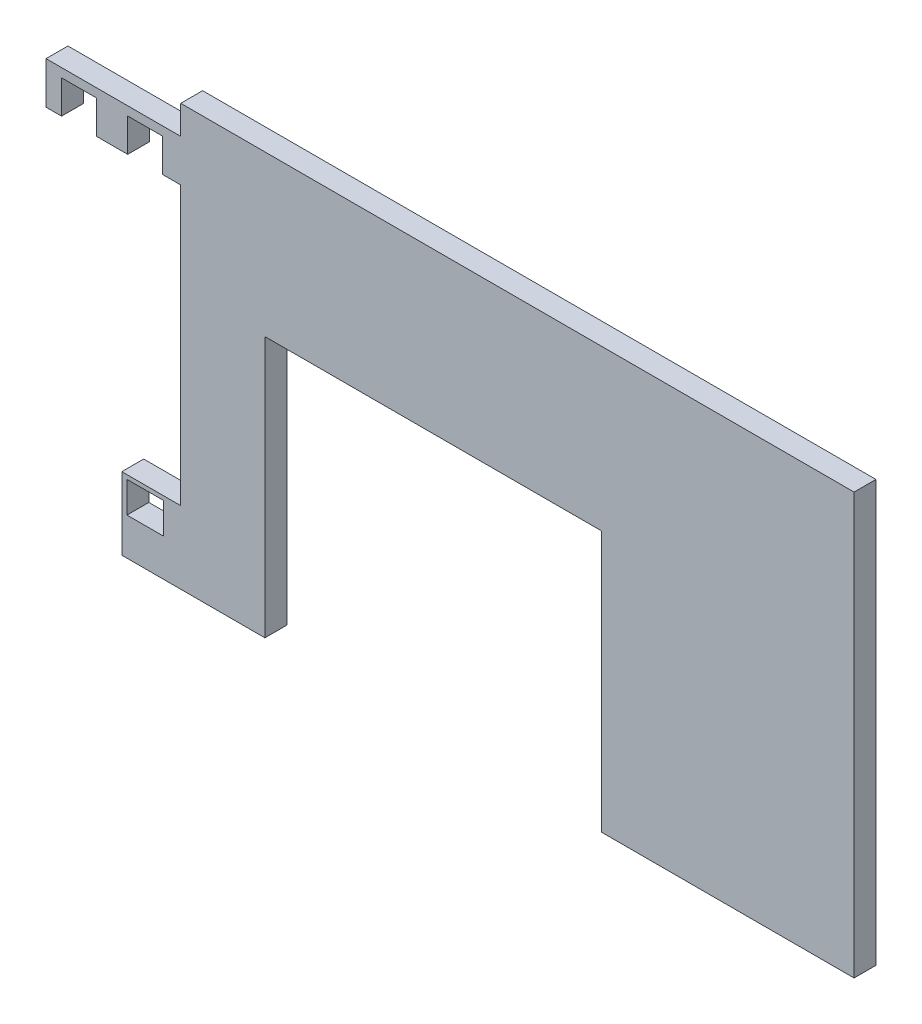
ISO-10303-21;
HEADER;
FILE_DESCRIPTION(('STEP AP214'),'2;1');
FILE_NAME('part.step','',(''),(''),'','','');
FILE_SCHEMA(('AUTOMOTIVE_DESIGN { 1 0 10303 214 1 1 1 1 }'));
ENDSEC;
DATA;
#1=APPLICATION_CONTEXT('core data for automotive mechanical design processes');
#2=APPLICATION_PROTOCOL_DEFINITION('international standard','automotive_design',2000,#1);
#3=PRODUCT_CONTEXT('',#1,'mechanical');
#4=PRODUCT('Part','Part','',(#3));
#5=PRODUCT_RELATED_PRODUCT_CATEGORY('part','',(#4));
#6=PRODUCT_DEFINITION_FORMATION('','',#4);
#7=PRODUCT_DEFINITION_CONTEXT('part definition',#1,'design');
#8=PRODUCT_DEFINITION('design','',#6,#7);
#9=PRODUCT_DEFINITION_SHAPE('','',#8);
#10=(LENGTH_UNIT() NAMED_UNIT(*) SI_UNIT(.MILLI.,.METRE.));
#11=(NAMED_UNIT(*) PLANE_ANGLE_UNIT() SI_UNIT($,.RADIAN.));
#12=(NAMED_UNIT(*) SI_UNIT($,.STERADIAN.) SOLID_ANGLE_UNIT());
#13=UNCERTAINTY_MEASURE_WITH_UNIT(LENGTH_MEASURE(1.E-05),#10,'distance_accuracy_value','');
#14=(GEOMETRIC_REPRESENTATION_CONTEXT(3) GLOBAL_UNCERTAINTY_ASSIGNED_CONTEXT((#13)) GLOBAL_UNIT_ASSIGNED_CONTEXT((#10,
#11,#12)) REPRESENTATION_CONTEXT('',''));
#15=CARTESIAN_POINT('',(0.,0.,0.));
#16=DIRECTION('',(0.,0.,1.));
#17=DIRECTION('',(1.,0.,0.));
#18=AXIS2_PLACEMENT_3D('',#15,#16,#17);
#19=CARTESIAN_POINT('',(-50.8,21.076628061647,-21.2890793600851));
#20=DIRECTION('',(0.,-1.,0.));
#21=DIRECTION('',(0.,0.,-1.));
#22=AXIS2_PLACEMENT_3D('',#19,#20,#21);
#23=PLANE('',#22);
#24=DIRECTION('',(0.,0.,1.));
#25=VECTOR('',#24,1.);
#26=CARTESIAN_POINT('',(-68.7837095780898,21.076628061647,-0.00100000000000013));
#27=LINE('',#26,#25);
#28=CARTESIAN_POINT('',(-68.7837095780898,21.076628061647,0.));
#29=VERTEX_POINT('',#28);
#30=CARTESIAN_POINT('',(-68.7837095780898,21.076628061647,3.302));
#31=VERTEX_POINT('',#30);
#32=EDGE_CURVE('E209',#29,#31,#27,.T.);
#33=ORIENTED_EDGE('',*,*,#32,.T.);
#34=DIRECTION('',(1.,0.,0.));
#35=VECTOR('',#34,1.);
#36=CARTESIAN_POINT('',(-50.8,21.076628061647,3.302));
#37=LINE('',#36,#35);
#38=CARTESIAN_POINT('',(-71.12,21.076628061647,3.302));
#39=VERTEX_POINT('',#38);
#40=EDGE_CURVE('E335',#39,#31,#37,.T.);
#41=ORIENTED_EDGE('',*,*,#40,.F.);
#42=DIRECTION('',(0.,0.,1.));
#43=VECTOR('',#42,1.);
#44=CARTESIAN_POINT('',(-71.12,21.076628061647,-21.2890793600851));
#45=LINE('',#44,#43);
#46=CARTESIAN_POINT('',(-71.12,21.076628061647,0.));
#47=VERTEX_POINT('',#46);
#48=EDGE_CURVE('E231',#47,#39,#45,.T.);
#49=ORIENTED_EDGE('',*,*,#48,.F.);
#50=DIRECTION('',(-1.,0.,0.));
#51=VECTOR('',#50,1.);
#52=CARTESIAN_POINT('',(-50.8,21.076628061647,0.));
#53=LINE('',#52,#51);
#54=EDGE_CURVE('E226',#29,#47,#53,.T.);
#55=ORIENTED_EDGE('',*,*,#54,.F.);
#56=EDGE_LOOP('',(#33,#41,#49,#55));
#57=FACE_BOUND('',#56,.T.);
#58=ADVANCED_FACE('F37',(#57),#23,.T.);
#59=DIRECTION('',(0.,0.,-1.));
#60=VECTOR('',#59,1.);
#61=CARTESIAN_POINT('',(-53.5162904219102,21.076628061647,-0.00100000000000013));
#62=LINE('',#61,#60);
#63=CARTESIAN_POINT('',(-53.5162904219102,21.076628061647,3.302));
#64=VERTEX_POINT('',#63);
#65=CARTESIAN_POINT('',(-53.5162904219102,21.076628061647,0.));
#66=VERTEX_POINT('',#65);
#67=EDGE_CURVE('E363',#64,#66,#62,.T.);
#68=ORIENTED_EDGE('',*,*,#67,.T.);
#69=CARTESIAN_POINT('',(-50.8,21.076628061647,0.));
#70=VERTEX_POINT('',#69);
#71=EDGE_CURVE('E235',#70,#66,#53,.T.);
#72=ORIENTED_EDGE('',*,*,#71,.F.);
#73=DIRECTION('',(0.,0.,1.));
#74=VECTOR('',#73,1.);
#75=CARTESIAN_POINT('',(-50.8,21.076628061647,-21.2890793600851));
#76=LINE('',#75,#74);
#77=CARTESIAN_POINT('',(-50.8,21.076628061647,3.302));
#78=VERTEX_POINT('',#77);
#79=EDGE_CURVE('E237',#70,#78,#76,.T.);
#80=ORIENTED_EDGE('',*,*,#79,.T.);
#81=EDGE_CURVE('E329',#64,#78,#37,.T.);
#82=ORIENTED_EDGE('',*,*,#81,.F.);
#83=EDGE_LOOP('',(#68,#72,#80,#82));
#84=FACE_BOUND('',#83,.T.);
#85=ADVANCED_FACE('F470',(#84),#23,.T.);
#86=CARTESIAN_POINT('',(-50.8,-31.75,3.302));
#87=DIRECTION('',(1.,0.,0.));
#88=DIRECTION('',(0.,0.,-1.));
#89=AXIS2_PLACEMENT_3D('',#86,#87,#88);
#90=PLANE('',#89);
#91=DIRECTION('',(0.,-1.,0.));
#92=VECTOR('',#91,1.);
#93=CARTESIAN_POINT('',(-50.8,-31.75,0.));
#94=LINE('',#93,#92);
#95=CARTESIAN_POINT('',(-50.8,-20.828,0.));
#96=VERTEX_POINT('',#95);
#97=EDGE_CURVE('E277',#70,#96,#94,.T.);
#98=ORIENTED_EDGE('',*,*,#97,.T.);
#99=DIRECTION('',(0.,0.,1.));
#100=VECTOR('',#99,1.);
#101=CARTESIAN_POINT('',(-50.8,-20.828,-21.2890793600851));
#102=LINE('',#101,#100);
#103=CARTESIAN_POINT('',(-50.8,-20.828,3.302));
#104=VERTEX_POINT('',#103);
#105=EDGE_CURVE('E419',#96,#104,#102,.T.);
#106=ORIENTED_EDGE('',*,*,#105,.T.);
#107=DIRECTION('',(0.,-1.,0.));
#108=VECTOR('',#107,1.);
#109=CARTESIAN_POINT('',(-50.8,-31.75,3.302));
#110=LINE('',#109,#108);
#111=EDGE_CURVE('E282',#78,#104,#110,.T.);
#112=ORIENTED_EDGE('',*,*,#111,.F.);
#113=ORIENTED_EDGE('',*,*,#79,.F.);
#114=EDGE_LOOP('',(#98,#106,#112,#113));
#115=FACE_BOUND('',#114,.T.);
#116=ADVANCED_FACE('F428',(#115),#90,.F.);
#117=CARTESIAN_POINT('',(50.8,-31.75,3.302));
#118=DIRECTION('',(0.,1.,0.));
#119=DIRECTION('',(0.,0.,1.));
#120=AXIS2_PLACEMENT_3D('',#117,#118,#119);
#121=PLANE('',#120);
#122=DIRECTION('',(1.,0.,0.));
#123=VECTOR('',#122,1.);
#124=CARTESIAN_POINT('',(50.8,-31.75,0.));
#125=LINE('',#124,#123);
#126=CARTESIAN_POINT('',(-59.69,-31.75,0.));
#127=VERTEX_POINT('',#126);
#128=CARTESIAN_POINT('',(-38.1,-31.75,0.));
#129=VERTEX_POINT('',#128);
#130=EDGE_CURVE('E294',#127,#129,#125,.T.);
#131=ORIENTED_EDGE('',*,*,#130,.T.);
#132=DIRECTION('',(0.,0.,-1.));
#133=VECTOR('',#132,1.);
#134=CARTESIAN_POINT('',(-38.1,-31.75,-0.00100000000000013));
#135=LINE('',#134,#133);
#136=CARTESIAN_POINT('',(-38.1,-31.75,3.302));
#137=VERTEX_POINT('',#136);
#138=EDGE_CURVE('E251',#137,#129,#135,.T.);
#139=ORIENTED_EDGE('',*,*,#138,.F.);
#140=DIRECTION('',(1.,0.,0.));
#141=VECTOR('',#140,1.);
#142=CARTESIAN_POINT('',(50.8,-31.75,3.302));
#143=LINE('',#142,#141);
#144=CARTESIAN_POINT('',(-59.69,-31.75,3.302));
#145=VERTEX_POINT('',#144);
#146=EDGE_CURVE('E283',#145,#137,#143,.T.);
#147=ORIENTED_EDGE('',*,*,#146,.F.);
#148=DIRECTION('',(0.,0.,1.));
#149=VECTOR('',#148,1.);
#150=CARTESIAN_POINT('',(-59.69,-31.75,-21.2890793600851));
#151=LINE('',#150,#149);
#152=EDGE_CURVE('E413',#127,#145,#151,.T.);
#153=ORIENTED_EDGE('',*,*,#152,.F.);
#154=EDGE_LOOP('',(#131,#139,#147,#153));
#155=FACE_BOUND('',#154,.T.);
#156=ADVANCED_FACE('F445',(#155),#121,.F.);
#157=CARTESIAN_POINT('',(-50.8,31.75,0.));
#158=VERTEX_POINT('',#157);
#159=CARTESIAN_POINT('',(-50.8,27.426628061647,0.));
#160=VERTEX_POINT('',#159);
#161=EDGE_CURVE('E291',#158,#160,#94,.T.);
#162=ORIENTED_EDGE('',*,*,#161,.T.);
#163=DIRECTION('',(0.,0.,1.));
#164=VECTOR('',#163,1.);
#165=CARTESIAN_POINT('',(-50.8,27.426628061647,-21.2890793600851));
#166=LINE('',#165,#164);
#167=CARTESIAN_POINT('',(-50.8,27.426628061647,3.302));
#168=VERTEX_POINT('',#167);
#169=EDGE_CURVE('E254',#160,#168,#166,.T.);
#170=ORIENTED_EDGE('',*,*,#169,.T.);
#171=CARTESIAN_POINT('',(-50.8,31.75,3.302));
#172=VERTEX_POINT('',#171);
#173=EDGE_CURVE('E278',#172,#168,#110,.T.);
#174=ORIENTED_EDGE('',*,*,#173,.F.);
#175=DIRECTION('',(0.,0.,-1.));
#176=VECTOR('',#175,1.);
#177=CARTESIAN_POINT('',(-50.8,31.75,3.302));
#178=LINE('',#177,#176);
#179=EDGE_CURVE('E290',#172,#158,#178,.T.);
#180=ORIENTED_EDGE('',*,*,#179,.T.);
#181=EDGE_LOOP('',(#162,#170,#174,#180));
#182=FACE_BOUND('',#181,.T.);
#183=ADVANCED_FACE('F39',(#182),#90,.F.);
#184=CARTESIAN_POINT('',(12.7,-31.75,3.302));
#185=VERTEX_POINT('',#184);
#186=CARTESIAN_POINT('',(50.8,-31.75,3.302));
#187=VERTEX_POINT('',#186);
#188=EDGE_CURVE('E281',#185,#187,#143,.T.);
#189=ORIENTED_EDGE('',*,*,#188,.F.);
#190=DIRECTION('',(0.,0.,1.));
#191=VECTOR('',#190,1.);
#192=CARTESIAN_POINT('',(12.7,-31.75,-0.00100000000000013));
#193=LINE('',#192,#191);
#194=CARTESIAN_POINT('',(12.7,-31.75,0.));
#195=VERTEX_POINT('',#194);
#196=EDGE_CURVE('E246',#195,#185,#193,.T.);
#197=ORIENTED_EDGE('',*,*,#196,.F.);
#198=CARTESIAN_POINT('',(50.8,-31.75,0.));
#199=VERTEX_POINT('',#198);
#200=EDGE_CURVE('E293',#195,#199,#125,.T.);
#201=ORIENTED_EDGE('',*,*,#200,.T.);
#202=DIRECTION('',(0.,0.,-1.));
#203=VECTOR('',#202,1.);
#204=CARTESIAN_POINT('',(50.8,-31.75,3.302));
#205=LINE('',#204,#203);
#206=EDGE_CURVE('E11',#187,#199,#205,.T.);
#207=ORIENTED_EDGE('',*,*,#206,.F.);
#208=EDGE_LOOP('',(#189,#197,#201,#207));
#209=FACE_BOUND('',#208,.T.);
#210=ADVANCED_FACE('F460',(#209),#121,.F.);
#211=CARTESIAN_POINT('',(50.8,-31.75,3.302));
#212=DIRECTION('',(-1.,0.,0.));
#213=DIRECTION('',(0.,0.,1.));
#214=AXIS2_PLACEMENT_3D('',#211,#212,#213);
#215=PLANE('',#214);
#216=DIRECTION('',(0.,1.,0.));
#217=VECTOR('',#216,1.);
#218=CARTESIAN_POINT('',(50.8,-31.75,0.));
#219=LINE('',#218,#217);
#220=CARTESIAN_POINT('',(50.8,31.75,0.));
#221=VERTEX_POINT('',#220);
#222=EDGE_CURVE('E297',#199,#221,#219,.T.);
#223=ORIENTED_EDGE('',*,*,#222,.T.);
#224=DIRECTION('',(0.,0.,-1.));
#225=VECTOR('',#224,1.);
#226=CARTESIAN_POINT('',(50.8,31.75,3.302));
#227=LINE('',#226,#225);
#228=CARTESIAN_POINT('',(50.8,31.75,3.302));
#229=VERTEX_POINT('',#228);
#230=EDGE_CURVE('E45',#229,#221,#227,.T.);
#231=ORIENTED_EDGE('',*,*,#230,.F.);
#232=DIRECTION('',(0.,1.,0.));
#233=VECTOR('',#232,1.);
#234=CARTESIAN_POINT('',(50.8,-31.75,3.302));
#235=LINE('',#234,#233);
#236=EDGE_CURVE('E286',#187,#229,#235,.T.);
#237=ORIENTED_EDGE('',*,*,#236,.F.);
#238=ORIENTED_EDGE('',*,*,#206,.T.);
#239=EDGE_LOOP('',(#223,#231,#237,#238));
#240=FACE_BOUND('',#239,.T.);
#241=ADVANCED_FACE('F461',(#240),#215,.F.);
#242=CARTESIAN_POINT('',(50.8,31.75,3.302));
#243=DIRECTION('',(0.,-1.,0.));
#244=DIRECTION('',(0.,0.,-1.));
#245=AXIS2_PLACEMENT_3D('',#242,#243,#244);
#246=PLANE('',#245);
#247=DIRECTION('',(-1.,0.,0.));
#248=VECTOR('',#247,1.);
#249=CARTESIAN_POINT('',(50.8,31.75,0.));
#250=LINE('',#249,#248);
#251=EDGE_CURVE('E299',#221,#158,#250,.T.);
#252=ORIENTED_EDGE('',*,*,#251,.T.);
#253=ORIENTED_EDGE('',*,*,#179,.F.);
#254=DIRECTION('',(-1.,0.,0.));
#255=VECTOR('',#254,1.);
#256=CARTESIAN_POINT('',(50.8,31.75,3.302));
#257=LINE('',#256,#255);
#258=EDGE_CURVE('E288',#229,#172,#257,.T.);
#259=ORIENTED_EDGE('',*,*,#258,.F.);
#260=ORIENTED_EDGE('',*,*,#230,.T.);
#261=EDGE_LOOP('',(#252,#253,#259,#260));
#262=FACE_BOUND('',#261,.T.);
#263=ADVANCED_FACE('F307',(#262),#246,.F.);
#264=CARTESIAN_POINT('',(0.,0.,3.302));
#265=DIRECTION('',(0.,0.,1.));
#266=DIRECTION('',(1.,0.,0.));
#267=AXIS2_PLACEMENT_3D('',#264,#265,#266);
#268=PLANE('',#267);
#269=DIRECTION('',(0.,-1.,0.));
#270=VECTOR('',#269,1.);
#271=CARTESIAN_POINT('',(-68.7837095780898,26.0929863981767,3.302));
#272=LINE('',#271,#270);
#273=CARTESIAN_POINT('',(-68.7837095780898,26.0929863981767,3.302));
#274=VERTEX_POINT('',#273);
#275=EDGE_CURVE('E215',#274,#31,#272,.T.);
#276=ORIENTED_EDGE('',*,*,#275,.F.);
#277=DIRECTION('',(-1.,0.,0.));
#278=VECTOR('',#277,1.);
#279=CARTESIAN_POINT('',(-68.7837095780898,26.0929863981767,3.302));
#280=LINE('',#279,#278);
#281=CARTESIAN_POINT('',(-63.4988664599956,26.0929863981767,3.302));
#282=VERTEX_POINT('',#281);
#283=EDGE_CURVE('E345',#282,#274,#280,.T.);
#284=ORIENTED_EDGE('',*,*,#283,.F.);
#285=DIRECTION('',(0.,1.,0.));
#286=VECTOR('',#285,1.);
#287=CARTESIAN_POINT('',(-63.4988664599956,26.0929863981767,3.302));
#288=LINE('',#287,#286);
#289=CARTESIAN_POINT('',(-63.4988664599956,21.076628061647,3.302));
#290=VERTEX_POINT('',#289);
#291=EDGE_CURVE('E346',#290,#282,#288,.T.);
#292=ORIENTED_EDGE('',*,*,#291,.F.);
#293=CARTESIAN_POINT('',(-58.8011335400044,21.076628061647,3.302));
#294=VERTEX_POINT('',#293);
#295=EDGE_CURVE('E337',#290,#294,#37,.T.);
#296=ORIENTED_EDGE('',*,*,#295,.T.);
#297=DIRECTION('',(0.,-1.,0.));
#298=VECTOR('',#297,1.);
#299=CARTESIAN_POINT('',(-58.8011335400044,26.0929863981767,3.302));
#300=LINE('',#299,#298);
#301=CARTESIAN_POINT('',(-58.8011335400044,26.0929863981767,3.302));
#302=VERTEX_POINT('',#301);
#303=EDGE_CURVE('E374',#302,#294,#300,.T.);
#304=ORIENTED_EDGE('',*,*,#303,.F.);
#305=DIRECTION('',(-1.,0.,0.));
#306=VECTOR('',#305,1.);
#307=CARTESIAN_POINT('',(-53.5162904219102,26.0929863981767,3.302));
#308=LINE('',#307,#306);
#309=CARTESIAN_POINT('',(-53.5162904219102,26.0929863981767,3.302));
#310=VERTEX_POINT('',#309);
#311=EDGE_CURVE('E371',#310,#302,#308,.T.);
#312=ORIENTED_EDGE('',*,*,#311,.F.);
#313=DIRECTION('',(0.,1.,0.));
#314=VECTOR('',#313,1.);
#315=CARTESIAN_POINT('',(-53.5162904219102,26.0929863981767,3.302));
#316=LINE('',#315,#314);
#317=EDGE_CURVE('E376',#64,#310,#316,.T.);
#318=ORIENTED_EDGE('',*,*,#317,.F.);
#319=ORIENTED_EDGE('',*,*,#81,.T.);
#320=ORIENTED_EDGE('',*,*,#111,.T.);
#321=DIRECTION('',(-1.,0.,0.));
#322=VECTOR('',#321,1.);
#323=CARTESIAN_POINT('',(-50.8,-20.828,3.302));
#324=LINE('',#323,#322);
#325=CARTESIAN_POINT('',(-59.69,-20.828,3.302));
#326=VERTEX_POINT('',#325);
#327=EDGE_CURVE('E359',#104,#326,#324,.T.);
#328=ORIENTED_EDGE('',*,*,#327,.T.);
#329=DIRECTION('',(0.,-1.,0.));
#330=VECTOR('',#329,1.);
#331=CARTESIAN_POINT('',(-59.69,-31.75,3.302));
#332=LINE('',#331,#330);
#333=EDGE_CURVE('E416',#326,#145,#332,.T.);
#334=ORIENTED_EDGE('',*,*,#333,.T.);
#335=ORIENTED_EDGE('',*,*,#146,.T.);
#336=DIRECTION('',(0.,-1.,0.));
#337=VECTOR('',#336,1.);
#338=CARTESIAN_POINT('',(-38.1,-38.1,3.302));
#339=LINE('',#338,#337);
#340=CARTESIAN_POINT('',(-38.1,7.62000000000001,3.302));
#341=VERTEX_POINT('',#340);
#342=EDGE_CURVE('E263',#341,#137,#339,.T.);
#343=ORIENTED_EDGE('',*,*,#342,.F.);
#344=DIRECTION('',(-1.,0.,0.));
#345=VECTOR('',#344,1.);
#346=CARTESIAN_POINT('',(-38.1,7.62000000000001,3.302));
#347=LINE('',#346,#345);
#348=CARTESIAN_POINT('',(12.7,7.62000000000001,3.302));
#349=VERTEX_POINT('',#348);
#350=EDGE_CURVE('E268',#349,#341,#347,.T.);
#351=ORIENTED_EDGE('',*,*,#350,.F.);
#352=DIRECTION('',(0.,1.,0.));
#353=VECTOR('',#352,1.);
#354=CARTESIAN_POINT('',(12.7,-38.1,3.302));
#355=LINE('',#354,#353);
#356=EDGE_CURVE('E265',#185,#349,#355,.T.);
#357=ORIENTED_EDGE('',*,*,#356,.F.);
#358=ORIENTED_EDGE('',*,*,#188,.T.);
#359=ORIENTED_EDGE('',*,*,#236,.T.);
#360=ORIENTED_EDGE('',*,*,#258,.T.);
#361=ORIENTED_EDGE('',*,*,#173,.T.);
#362=DIRECTION('',(-1.,0.,0.));
#363=VECTOR('',#362,1.);
#364=CARTESIAN_POINT('',(-50.8,27.426628061647,3.302));
#365=LINE('',#364,#363);
#366=CARTESIAN_POINT('',(-71.12,27.426628061647,3.302));
#367=VERTEX_POINT('',#366);
#368=EDGE_CURVE('E321',#168,#367,#365,.T.);
#369=ORIENTED_EDGE('',*,*,#368,.T.);
#370=DIRECTION('',(0.,-1.,0.));
#371=VECTOR('',#370,1.);
#372=CARTESIAN_POINT('',(-71.12,21.076628061647,3.302));
#373=LINE('',#372,#371);
#374=EDGE_CURVE('E327',#367,#39,#373,.T.);
#375=ORIENTED_EDGE('',*,*,#374,.T.);
#376=ORIENTED_EDGE('',*,*,#40,.T.);
#377=EDGE_LOOP('',(#276,#284,#292,#296,#304,#312,#318,#319,#320,#328,#334,#335,#343,#351,#357,
#358,#359,#360,#361,#369,#375,#376));
#378=FACE_BOUND('',#377,.T.);
#379=DIRECTION('',(0.,-1.,0.));
#380=VECTOR('',#379,1.);
#381=CARTESIAN_POINT('',(-58.9105914384986,-21.444804226857,3.302));
#382=LINE('',#381,#380);
#383=CARTESIAN_POINT('',(-58.9105914384986,-21.444804226857,3.302));
#384=VERTEX_POINT('',#383);
#385=CARTESIAN_POINT('',(-58.9105914384986,-26.1131993870927,3.302));
#386=VERTEX_POINT('',#385);
#387=EDGE_CURVE('E52',#384,#386,#382,.T.);
#388=ORIENTED_EDGE('',*,*,#387,.F.);
#389=DIRECTION('',(-1.,0.,0.));
#390=VECTOR('',#389,1.);
#391=CARTESIAN_POINT('',(-58.9105914384986,-21.444804226857,3.302));
#392=LINE('',#391,#390);
#393=CARTESIAN_POINT('',(-53.3876390819089,-21.444804226857,3.302));
#394=VERTEX_POINT('',#393);
#395=EDGE_CURVE('E399',#394,#384,#392,.T.);
#396=ORIENTED_EDGE('',*,*,#395,.F.);
#397=DIRECTION('',(0.,1.,0.));
#398=VECTOR('',#397,1.);
#399=CARTESIAN_POINT('',(-53.3876390819089,-21.444804226857,3.302));
#400=LINE('',#399,#398);
#401=CARTESIAN_POINT('',(-53.3876390819089,-26.1131993870927,3.302));
#402=VERTEX_POINT('',#401);
#403=EDGE_CURVE('E396',#402,#394,#400,.T.);
#404=ORIENTED_EDGE('',*,*,#403,.F.);
#405=DIRECTION('',(1.,0.,0.));
#406=VECTOR('',#405,1.);
#407=CARTESIAN_POINT('',(-58.9105914384986,-26.1131993870927,3.302));
#408=LINE('',#407,#406);
#409=EDGE_CURVE('E393',#386,#402,#408,.T.);
#410=ORIENTED_EDGE('',*,*,#409,.F.);
#411=EDGE_LOOP('',(#388,#396,#404,#410));
#412=FACE_BOUND('',#411,.T.);
#413=ADVANCED_FACE('F318',(#378,#412),#268,.T.);
#414=CARTESIAN_POINT('',(0.,0.,0.));
#415=DIRECTION('',(0.,0.,1.));
#416=DIRECTION('',(1.,0.,0.));
#417=AXIS2_PLACEMENT_3D('',#414,#415,#416);
#418=PLANE('',#417);
#419=DIRECTION('',(1.,0.,0.));
#420=VECTOR('',#419,1.);
#421=CARTESIAN_POINT('',(-58.9105914384986,-21.444804226857,0.));
#422=LINE('',#421,#420);
#423=CARTESIAN_POINT('',(-58.9105914384986,-21.444804226857,0.));
#424=VERTEX_POINT('',#423);
#425=CARTESIAN_POINT('',(-53.3876390819089,-21.444804226857,0.));
#426=VERTEX_POINT('',#425);
#427=EDGE_CURVE('E386',#424,#426,#422,.T.);
#428=ORIENTED_EDGE('',*,*,#427,.F.);
#429=DIRECTION('',(0.,1.,0.));
#430=VECTOR('',#429,1.);
#431=CARTESIAN_POINT('',(-58.9105914384986,-21.444804226857,0.));
#432=LINE('',#431,#430);
#433=CARTESIAN_POINT('',(-58.9105914384986,-26.1131993870927,0.));
#434=VERTEX_POINT('',#433);
#435=EDGE_CURVE('E389',#434,#424,#432,.T.);
#436=ORIENTED_EDGE('',*,*,#435,.F.);
#437=DIRECTION('',(-1.,0.,0.));
#438=VECTOR('',#437,1.);
#439=CARTESIAN_POINT('',(-58.9105914384986,-26.1131993870927,0.));
#440=LINE('',#439,#438);
#441=CARTESIAN_POINT('',(-53.3876390819089,-26.1131993870927,0.));
#442=VERTEX_POINT('',#441);
#443=EDGE_CURVE('E364',#442,#434,#440,.T.);
#444=ORIENTED_EDGE('',*,*,#443,.F.);
#445=DIRECTION('',(0.,-1.,0.));
#446=VECTOR('',#445,1.);
#447=CARTESIAN_POINT('',(-53.3876390819089,-21.444804226857,0.));
#448=LINE('',#447,#446);
#449=EDGE_CURVE('E60',#426,#442,#448,.T.);
#450=ORIENTED_EDGE('',*,*,#449,.F.);
#451=EDGE_LOOP('',(#428,#436,#444,#450));
#452=FACE_BOUND('',#451,.T.);
#453=DIRECTION('',(1.,0.,0.));
#454=VECTOR('',#453,1.);
#455=CARTESIAN_POINT('',(-68.7837095780898,26.0929863981767,0.));
#456=LINE('',#455,#454);
#457=CARTESIAN_POINT('',(-68.7837095780898,26.0929863981767,0.));
#458=VERTEX_POINT('',#457);
#459=CARTESIAN_POINT('',(-63.4988664599956,26.0929863981767,0.));
#460=VERTEX_POINT('',#459);
#461=EDGE_CURVE('E220',#458,#460,#456,.T.);
#462=ORIENTED_EDGE('',*,*,#461,.F.);
#463=DIRECTION('',(0.,1.,0.));
#464=VECTOR('',#463,1.);
#465=CARTESIAN_POINT('',(-68.7837095780898,26.0929863981767,0.));
#466=LINE('',#465,#464);
#467=EDGE_CURVE('E212',#29,#458,#466,.T.);
#468=ORIENTED_EDGE('',*,*,#467,.F.);
#469=ORIENTED_EDGE('',*,*,#54,.T.);
#470=DIRECTION('',(0.,1.,0.));
#471=VECTOR('',#470,1.);
#472=CARTESIAN_POINT('',(-71.12,21.076628061647,0.));
#473=LINE('',#472,#471);
#474=CARTESIAN_POINT('',(-71.12,27.426628061647,0.));
#475=VERTEX_POINT('',#474);
#476=EDGE_CURVE('E233',#47,#475,#473,.T.);
#477=ORIENTED_EDGE('',*,*,#476,.T.);
#478=DIRECTION('',(1.,0.,0.));
#479=VECTOR('',#478,1.);
#480=CARTESIAN_POINT('',(-50.8,27.426628061647,0.));
#481=LINE('',#480,#479);
#482=EDGE_CURVE('E241',#475,#160,#481,.T.);
#483=ORIENTED_EDGE('',*,*,#482,.T.);
#484=ORIENTED_EDGE('',*,*,#161,.F.);
#485=ORIENTED_EDGE('',*,*,#251,.F.);
#486=ORIENTED_EDGE('',*,*,#222,.F.);
#487=ORIENTED_EDGE('',*,*,#200,.F.);
#488=DIRECTION('',(0.,-1.,0.));
#489=VECTOR('',#488,1.);
#490=CARTESIAN_POINT('',(12.7,-38.1,0.));
#491=LINE('',#490,#489);
#492=CARTESIAN_POINT('',(12.7,7.62000000000001,0.));
#493=VERTEX_POINT('',#492);
#494=EDGE_CURVE('E274',#493,#195,#491,.T.);
#495=ORIENTED_EDGE('',*,*,#494,.F.);
#496=DIRECTION('',(1.,0.,0.));
#497=VECTOR('',#496,1.);
#498=CARTESIAN_POINT('',(-38.1,7.62000000000001,0.));
#499=LINE('',#498,#497);
#500=CARTESIAN_POINT('',(-38.1,7.62000000000001,0.));
#501=VERTEX_POINT('',#500);
#502=EDGE_CURVE('E258',#501,#493,#499,.T.);
#503=ORIENTED_EDGE('',*,*,#502,.F.);
#504=DIRECTION('',(0.,1.,0.));
#505=VECTOR('',#504,1.);
#506=CARTESIAN_POINT('',(-38.1,-38.1,0.));
#507=LINE('',#506,#505);
#508=EDGE_CURVE('E261',#129,#501,#507,.T.);
#509=ORIENTED_EDGE('',*,*,#508,.F.);
#510=ORIENTED_EDGE('',*,*,#130,.F.);
#511=DIRECTION('',(0.,1.,0.));
#512=VECTOR('',#511,1.);
#513=CARTESIAN_POINT('',(-59.69,-31.75,0.));
#514=LINE('',#513,#512);
#515=CARTESIAN_POINT('',(-59.69,-20.828,0.));
#516=VERTEX_POINT('',#515);
#517=EDGE_CURVE('E332',#127,#516,#514,.T.);
#518=ORIENTED_EDGE('',*,*,#517,.T.);
#519=DIRECTION('',(1.,0.,0.));
#520=VECTOR('',#519,1.);
#521=CARTESIAN_POINT('',(-50.8,-20.828,0.));
#522=LINE('',#521,#520);
#523=EDGE_CURVE('E328',#516,#96,#522,.T.);
#524=ORIENTED_EDGE('',*,*,#523,.T.);
#525=ORIENTED_EDGE('',*,*,#97,.F.);
#526=ORIENTED_EDGE('',*,*,#71,.T.);
#527=DIRECTION('',(0.,-1.,0.));
#528=VECTOR('',#527,1.);
#529=CARTESIAN_POINT('',(-53.5162904219102,26.0929863981767,0.));
#530=LINE('',#529,#528);
#531=CARTESIAN_POINT('',(-53.5162904219102,26.0929863981767,0.));
#532=VERTEX_POINT('',#531);
#533=EDGE_CURVE('E369',#532,#66,#530,.T.);
#534=ORIENTED_EDGE('',*,*,#533,.F.);
#535=DIRECTION('',(1.,0.,0.));
#536=VECTOR('',#535,1.);
#537=CARTESIAN_POINT('',(-53.5162904219102,26.0929863981767,0.));
#538=LINE('',#537,#536);
#539=CARTESIAN_POINT('',(-58.8011335400044,26.0929863981767,0.));
#540=VERTEX_POINT('',#539);
#541=EDGE_CURVE('E367',#540,#532,#538,.T.);
#542=ORIENTED_EDGE('',*,*,#541,.F.);
#543=DIRECTION('',(0.,1.,0.));
#544=VECTOR('',#543,1.);
#545=CARTESIAN_POINT('',(-58.8011335400044,26.0929863981767,0.));
#546=LINE('',#545,#544);
#547=CARTESIAN_POINT('',(-58.8011335400044,21.076628061647,0.));
#548=VERTEX_POINT('',#547);
#549=EDGE_CURVE('E382',#548,#540,#546,.T.);
#550=ORIENTED_EDGE('',*,*,#549,.F.);
#551=CARTESIAN_POINT('',(-63.4988664599956,21.076628061647,0.));
#552=VERTEX_POINT('',#551);
#553=EDGE_CURVE('E232',#548,#552,#53,.T.);
#554=ORIENTED_EDGE('',*,*,#553,.T.);
#555=DIRECTION('',(0.,-1.,0.));
#556=VECTOR('',#555,1.);
#557=CARTESIAN_POINT('',(-63.4988664599956,26.0929863981767,0.));
#558=LINE('',#557,#556);
#559=EDGE_CURVE('E356',#460,#552,#558,.T.);
#560=ORIENTED_EDGE('',*,*,#559,.F.);
#561=EDGE_LOOP('',(#462,#468,#469,#477,#483,#484,#485,#486,#487,#495,#503,#509,#510,#518,#524,
#525,#526,#534,#542,#550,#554,#560));
#562=FACE_BOUND('',#561,.T.);
#563=ADVANCED_FACE('F225',(#452,#562),#418,.F.);
#564=CARTESIAN_POINT('',(-38.1,-38.1,-0.00100000000000013));
#565=DIRECTION('',(-1.,0.,0.));
#566=DIRECTION('',(0.,0.,1.));
#567=AXIS2_PLACEMENT_3D('',#564,#565,#566);
#568=PLANE('',#567);
#569=ORIENTED_EDGE('',*,*,#138,.T.);
#570=ORIENTED_EDGE('',*,*,#508,.T.);
#571=DIRECTION('',(0.,0.,1.));
#572=VECTOR('',#571,1.);
#573=CARTESIAN_POINT('',(-38.1,7.62000000000001,-0.00100000000000013));
#574=LINE('',#573,#572);
#575=EDGE_CURVE('E272',#501,#341,#574,.T.);
#576=ORIENTED_EDGE('',*,*,#575,.T.);
#577=ORIENTED_EDGE('',*,*,#342,.T.);
#578=EDGE_LOOP('',(#569,#570,#576,#577));
#579=FACE_BOUND('',#578,.T.);
#580=ADVANCED_FACE('F448',(#579),#568,.F.);
#581=CARTESIAN_POINT('',(-38.1,7.62000000000001,-0.00100000000000013));
#582=DIRECTION('',(0.,1.,0.));
#583=DIRECTION('',(0.,0.,1.));
#584=AXIS2_PLACEMENT_3D('',#581,#582,#583);
#585=PLANE('',#584);
#586=ORIENTED_EDGE('',*,*,#502,.T.);
#587=DIRECTION('',(0.,0.,1.));
#588=VECTOR('',#587,1.);
#589=CARTESIAN_POINT('',(12.7,7.62000000000001,-0.00100000000000013));
#590=LINE('',#589,#588);
#591=EDGE_CURVE('E271',#493,#349,#590,.T.);
#592=ORIENTED_EDGE('',*,*,#591,.T.);
#593=ORIENTED_EDGE('',*,*,#350,.T.);
#594=ORIENTED_EDGE('',*,*,#575,.F.);
#595=EDGE_LOOP('',(#586,#592,#593,#594));
#596=FACE_BOUND('',#595,.T.);
#597=ADVANCED_FACE('F453',(#596),#585,.F.);
#598=CARTESIAN_POINT('',(12.7,-38.1,-0.00100000000000013));
#599=DIRECTION('',(1.,0.,0.));
#600=DIRECTION('',(0.,0.,-1.));
#601=AXIS2_PLACEMENT_3D('',#598,#599,#600);
#602=PLANE('',#601);
#603=ORIENTED_EDGE('',*,*,#196,.T.);
#604=ORIENTED_EDGE('',*,*,#356,.T.);
#605=ORIENTED_EDGE('',*,*,#591,.F.);
#606=ORIENTED_EDGE('',*,*,#494,.T.);
#607=EDGE_LOOP('',(#603,#604,#605,#606));
#608=FACE_BOUND('',#607,.T.);
#609=ADVANCED_FACE('F481',(#608),#602,.F.);
#610=DIRECTION('',(0.,0.,-1.));
#611=VECTOR('',#610,1.);
#612=CARTESIAN_POINT('',(-63.4988664599956,21.076628061647,-0.00100000000000013));
#613=LINE('',#612,#611);
#614=EDGE_CURVE('E221',#290,#552,#613,.T.);
#615=ORIENTED_EDGE('',*,*,#614,.T.);
#616=ORIENTED_EDGE('',*,*,#553,.F.);
#617=DIRECTION('',(0.,0.,1.));
#618=VECTOR('',#617,1.);
#619=CARTESIAN_POINT('',(-58.8011335400044,21.076628061647,-0.00100000000000013));
#620=LINE('',#619,#618);
#621=EDGE_CURVE('E360',#548,#294,#620,.T.);
#622=ORIENTED_EDGE('',*,*,#621,.T.);
#623=ORIENTED_EDGE('',*,*,#295,.F.);
#624=EDGE_LOOP('',(#615,#616,#622,#623));
#625=FACE_BOUND('',#624,.T.);
#626=ADVANCED_FACE('F472',(#625),#23,.T.);
#627=CARTESIAN_POINT('',(-71.12,21.076628061647,-21.2890793600851));
#628=DIRECTION('',(-1.,0.,0.));
#629=DIRECTION('',(0.,0.,1.));
#630=AXIS2_PLACEMENT_3D('',#627,#628,#629);
#631=PLANE('',#630);
#632=ORIENTED_EDGE('',*,*,#476,.F.);
#633=ORIENTED_EDGE('',*,*,#48,.T.);
#634=ORIENTED_EDGE('',*,*,#374,.F.);
#635=DIRECTION('',(0.,0.,1.));
#636=VECTOR('',#635,1.);
#637=CARTESIAN_POINT('',(-71.12,27.426628061647,-21.2890793600851));
#638=LINE('',#637,#636);
#639=EDGE_CURVE('E325',#475,#367,#638,.T.);
#640=ORIENTED_EDGE('',*,*,#639,.F.);
#641=EDGE_LOOP('',(#632,#633,#634,#640));
#642=FACE_BOUND('',#641,.T.);
#643=ADVANCED_FACE('F341',(#642),#631,.T.);
#644=CARTESIAN_POINT('',(-50.8,27.426628061647,-21.2890793600851));
#645=DIRECTION('',(0.,1.,0.));
#646=DIRECTION('',(0.,0.,1.));
#647=AXIS2_PLACEMENT_3D('',#644,#645,#646);
#648=PLANE('',#647);
#649=ORIENTED_EDGE('',*,*,#482,.F.);
#650=ORIENTED_EDGE('',*,*,#639,.T.);
#651=ORIENTED_EDGE('',*,*,#368,.F.);
#652=ORIENTED_EDGE('',*,*,#169,.F.);
#653=EDGE_LOOP('',(#649,#650,#651,#652));
#654=FACE_BOUND('',#653,.T.);
#655=ADVANCED_FACE('F323',(#654),#648,.T.);
#656=CARTESIAN_POINT('',(-59.69,-31.75,-21.2890793600851));
#657=DIRECTION('',(-1.,0.,0.));
#658=DIRECTION('',(0.,-1.,0.));
#659=AXIS2_PLACEMENT_3D('',#656,#657,#658);
#660=PLANE('',#659);
#661=ORIENTED_EDGE('',*,*,#517,.F.);
#662=ORIENTED_EDGE('',*,*,#152,.T.);
#663=ORIENTED_EDGE('',*,*,#333,.F.);
#664=DIRECTION('',(0.,0.,1.));
#665=VECTOR('',#664,1.);
#666=CARTESIAN_POINT('',(-59.69,-20.828,-21.2890793600851));
#667=LINE('',#666,#665);
#668=EDGE_CURVE('E422',#516,#326,#667,.T.);
#669=ORIENTED_EDGE('',*,*,#668,.F.);
#670=EDGE_LOOP('',(#661,#662,#663,#669));
#671=FACE_BOUND('',#670,.T.);
#672=ADVANCED_FACE('F439',(#671),#660,.T.);
#673=CARTESIAN_POINT('',(-50.8,-20.828,-21.2890793600851));
#674=DIRECTION('',(0.,1.,0.));
#675=DIRECTION('',(0.,0.,1.));
#676=AXIS2_PLACEMENT_3D('',#673,#674,#675);
#677=PLANE('',#676);
#678=ORIENTED_EDGE('',*,*,#523,.F.);
#679=ORIENTED_EDGE('',*,*,#668,.T.);
#680=ORIENTED_EDGE('',*,*,#327,.F.);
#681=ORIENTED_EDGE('',*,*,#105,.F.);
#682=EDGE_LOOP('',(#678,#679,#680,#681));
#683=FACE_BOUND('',#682,.T.);
#684=ADVANCED_FACE('F434',(#683),#677,.T.);
#685=CARTESIAN_POINT('',(-53.5162904219102,26.0929863981767,-0.00100000000000013));
#686=DIRECTION('',(0.,1.,0.));
#687=DIRECTION('',(0.,0.,1.));
#688=AXIS2_PLACEMENT_3D('',#685,#686,#687);
#689=PLANE('',#688);
#690=ORIENTED_EDGE('',*,*,#541,.T.);
#691=DIRECTION('',(0.,0.,1.));
#692=VECTOR('',#691,1.);
#693=CARTESIAN_POINT('',(-53.5162904219102,26.0929863981767,-0.00100000000000013));
#694=LINE('',#693,#692);
#695=EDGE_CURVE('E380',#532,#310,#694,.T.);
#696=ORIENTED_EDGE('',*,*,#695,.T.);
#697=ORIENTED_EDGE('',*,*,#311,.T.);
#698=DIRECTION('',(0.,0.,1.));
#699=VECTOR('',#698,1.);
#700=CARTESIAN_POINT('',(-58.8011335400044,26.0929863981767,-0.00100000000000013));
#701=LINE('',#700,#699);
#702=EDGE_CURVE('E379',#540,#302,#701,.T.);
#703=ORIENTED_EDGE('',*,*,#702,.F.);
#704=EDGE_LOOP('',(#690,#696,#697,#703));
#705=FACE_BOUND('',#704,.T.);
#706=ADVANCED_FACE('F501',(#705),#689,.F.);
#707=CARTESIAN_POINT('',(-53.5162904219102,26.0929863981767,-0.00100000000000013));
#708=DIRECTION('',(1.,0.,0.));
#709=DIRECTION('',(0.,0.,-1.));
#710=AXIS2_PLACEMENT_3D('',#707,#708,#709);
#711=PLANE('',#710);
#712=ORIENTED_EDGE('',*,*,#533,.T.);
#713=ORIENTED_EDGE('',*,*,#67,.F.);
#714=ORIENTED_EDGE('',*,*,#317,.T.);
#715=ORIENTED_EDGE('',*,*,#695,.F.);
#716=EDGE_LOOP('',(#712,#713,#714,#715));
#717=FACE_BOUND('',#716,.T.);
#718=ADVANCED_FACE('F519',(#717),#711,.F.);
#719=CARTESIAN_POINT('',(-58.8011335400044,26.0929863981767,-0.00100000000000013));
#720=DIRECTION('',(-1.,0.,0.));
#721=DIRECTION('',(0.,0.,1.));
#722=AXIS2_PLACEMENT_3D('',#719,#720,#721);
#723=PLANE('',#722);
#724=ORIENTED_EDGE('',*,*,#549,.T.);
#725=ORIENTED_EDGE('',*,*,#702,.T.);
#726=ORIENTED_EDGE('',*,*,#303,.T.);
#727=ORIENTED_EDGE('',*,*,#621,.F.);
#728=EDGE_LOOP('',(#724,#725,#726,#727));
#729=FACE_BOUND('',#728,.T.);
#730=ADVANCED_FACE('F499',(#729),#723,.F.);
#731=CARTESIAN_POINT('',(-68.7837095780898,26.0929863981767,-0.00100000000000013));
#732=DIRECTION('',(-1.,0.,0.));
#733=DIRECTION('',(0.,0.,1.));
#734=AXIS2_PLACEMENT_3D('',#731,#732,#733);
#735=PLANE('',#734);
#736=ORIENTED_EDGE('',*,*,#467,.T.);
#737=DIRECTION('',(0.,0.,1.));
#738=VECTOR('',#737,1.);
#739=CARTESIAN_POINT('',(-68.7837095780898,26.0929863981767,-0.00100000000000013));
#740=LINE('',#739,#738);
#741=EDGE_CURVE('E354',#458,#274,#740,.T.);
#742=ORIENTED_EDGE('',*,*,#741,.T.);
#743=ORIENTED_EDGE('',*,*,#275,.T.);
#744=ORIENTED_EDGE('',*,*,#32,.F.);
#745=EDGE_LOOP('',(#736,#742,#743,#744));
#746=FACE_BOUND('',#745,.T.);
#747=ADVANCED_FACE('F211',(#746),#735,.F.);
#748=CARTESIAN_POINT('',(-68.7837095780898,26.0929863981767,-0.00100000000000013));
#749=DIRECTION('',(0.,1.,0.));
#750=DIRECTION('',(0.,0.,1.));
#751=AXIS2_PLACEMENT_3D('',#748,#749,#750);
#752=PLANE('',#751);
#753=ORIENTED_EDGE('',*,*,#461,.T.);
#754=DIRECTION('',(0.,0.,1.));
#755=VECTOR('',#754,1.);
#756=CARTESIAN_POINT('',(-63.4988664599956,26.0929863981767,-0.00100000000000013));
#757=LINE('',#756,#755);
#758=EDGE_CURVE('E353',#460,#282,#757,.T.);
#759=ORIENTED_EDGE('',*,*,#758,.T.);
#760=ORIENTED_EDGE('',*,*,#283,.T.);
#761=ORIENTED_EDGE('',*,*,#741,.F.);
#762=EDGE_LOOP('',(#753,#759,#760,#761));
#763=FACE_BOUND('',#762,.T.);
#764=ADVANCED_FACE('F508',(#763),#752,.F.);
#765=CARTESIAN_POINT('',(-63.4988664599956,26.0929863981767,-0.00100000000000013));
#766=DIRECTION('',(1.,0.,0.));
#767=DIRECTION('',(0.,0.,-1.));
#768=AXIS2_PLACEMENT_3D('',#765,#766,#767);
#769=PLANE('',#768);
#770=ORIENTED_EDGE('',*,*,#559,.T.);
#771=ORIENTED_EDGE('',*,*,#614,.F.);
#772=ORIENTED_EDGE('',*,*,#291,.T.);
#773=ORIENTED_EDGE('',*,*,#758,.F.);
#774=EDGE_LOOP('',(#770,#771,#772,#773));
#775=FACE_BOUND('',#774,.T.);
#776=ADVANCED_FACE('F506',(#775),#769,.F.);
#777=CARTESIAN_POINT('',(-58.9105914384986,-21.444804226857,-0.00100000000000013));
#778=DIRECTION('',(-1.,0.,0.));
#779=DIRECTION('',(0.,0.,1.));
#780=AXIS2_PLACEMENT_3D('',#777,#778,#779);
#781=PLANE('',#780);
#782=ORIENTED_EDGE('',*,*,#435,.T.);
#783=DIRECTION('',(0.,0.,1.));
#784=VECTOR('',#783,1.);
#785=CARTESIAN_POINT('',(-58.9105914384986,-21.444804226857,-0.00100000000000013));
#786=LINE('',#785,#784);
#787=EDGE_CURVE('E403',#424,#384,#786,.T.);
#788=ORIENTED_EDGE('',*,*,#787,.T.);
#789=ORIENTED_EDGE('',*,*,#387,.T.);
#790=DIRECTION('',(0.,0.,1.));
#791=VECTOR('',#790,1.);
#792=CARTESIAN_POINT('',(-58.9105914384986,-26.1131993870927,-0.00100000000000013));
#793=LINE('',#792,#791);
#794=EDGE_CURVE('E402',#434,#386,#793,.T.);
#795=ORIENTED_EDGE('',*,*,#794,.F.);
#796=EDGE_LOOP('',(#782,#788,#789,#795));
#797=FACE_BOUND('',#796,.T.);
#798=ADVANCED_FACE('F515',(#797),#781,.F.);
#799=CARTESIAN_POINT('',(-58.9105914384986,-21.444804226857,-0.00100000000000013));
#800=DIRECTION('',(0.,1.,0.));
#801=DIRECTION('',(0.,0.,1.));
#802=AXIS2_PLACEMENT_3D('',#799,#800,#801);
#803=PLANE('',#802);
#804=ORIENTED_EDGE('',*,*,#427,.T.);
#805=DIRECTION('',(0.,0.,1.));
#806=VECTOR('',#805,1.);
#807=CARTESIAN_POINT('',(-53.3876390819089,-21.444804226857,-0.00100000000000013));
#808=LINE('',#807,#806);
#809=EDGE_CURVE('E405',#426,#394,#808,.T.);
#810=ORIENTED_EDGE('',*,*,#809,.T.);
#811=ORIENTED_EDGE('',*,*,#395,.T.);
#812=ORIENTED_EDGE('',*,*,#787,.F.);
#813=EDGE_LOOP('',(#804,#810,#811,#812));
#814=FACE_BOUND('',#813,.T.);
#815=ADVANCED_FACE('F527',(#814),#803,.F.);
#816=CARTESIAN_POINT('',(-53.3876390819089,-21.444804226857,-0.00100000000000013));
#817=DIRECTION('',(1.,0.,0.));
#818=DIRECTION('',(0.,0.,-1.));
#819=AXIS2_PLACEMENT_3D('',#816,#817,#818);
#820=PLANE('',#819);
#821=ORIENTED_EDGE('',*,*,#449,.T.);
#822=DIRECTION('',(0.,0.,1.));
#823=VECTOR('',#822,1.);
#824=CARTESIAN_POINT('',(-53.3876390819089,-26.1131993870927,-0.00100000000000013));
#825=LINE('',#824,#823);
#826=EDGE_CURVE('E407',#442,#402,#825,.T.);
#827=ORIENTED_EDGE('',*,*,#826,.T.);
#828=ORIENTED_EDGE('',*,*,#403,.T.);
#829=ORIENTED_EDGE('',*,*,#809,.F.);
#830=EDGE_LOOP('',(#821,#827,#828,#829));
#831=FACE_BOUND('',#830,.T.);
#832=ADVANCED_FACE('F530',(#831),#820,.F.);
#833=CARTESIAN_POINT('',(-58.9105914384986,-26.1131993870927,-0.00100000000000013));
#834=DIRECTION('',(0.,-1.,0.));
#835=DIRECTION('',(0.,0.,-1.));
#836=AXIS2_PLACEMENT_3D('',#833,#834,#835);
#837=PLANE('',#836);
#838=ORIENTED_EDGE('',*,*,#443,.T.);
#839=ORIENTED_EDGE('',*,*,#794,.T.);
#840=ORIENTED_EDGE('',*,*,#409,.T.);
#841=ORIENTED_EDGE('',*,*,#826,.F.);
#842=EDGE_LOOP('',(#838,#839,#840,#841));
#843=FACE_BOUND('',#842,.T.);
#844=ADVANCED_FACE('F534',(#843),#837,.F.);
#845=CLOSED_SHELL('',(#58,#85,#116,#156,#183,#210,#241,#263,#413,#563,#580,#597,#609,#626,#643,
#655,#672,#684,#706,#718,#730,#747,#764,#776,#798,#815,#832,#844));
#846=MANIFOLD_SOLID_BREP('B2',#845);
#847=ADVANCED_BREP_SHAPE_REPRESENTATION('',(#18,#846),#14);
#848=SHAPE_DEFINITION_REPRESENTATION(#9,#847);
ENDSEC;
END-ISO-10303-21;
